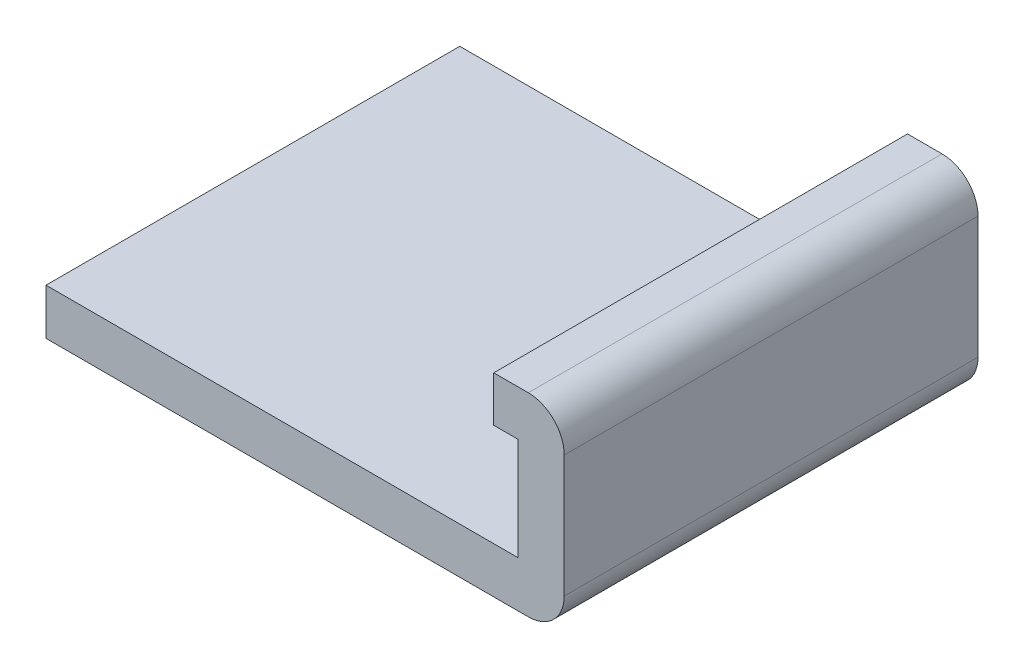
ISO-10303-21;
HEADER;
FILE_DESCRIPTION(('STEP AP214'),'2;1');
FILE_NAME('part.step','',(''),(''),'','','');
FILE_SCHEMA(('AUTOMOTIVE_DESIGN { 1 0 10303 214 1 1 1 1 }'));
ENDSEC;
DATA;
#1=APPLICATION_CONTEXT('core data for automotive mechanical design processes');
#2=APPLICATION_PROTOCOL_DEFINITION('international standard','automotive_design',2000,#1);
#3=PRODUCT_CONTEXT('',#1,'mechanical');
#4=PRODUCT('Part','Part','',(#3));
#5=PRODUCT_RELATED_PRODUCT_CATEGORY('part','',(#4));
#6=PRODUCT_DEFINITION_FORMATION('','',#4);
#7=PRODUCT_DEFINITION_CONTEXT('part definition',#1,'design');
#8=PRODUCT_DEFINITION('design','',#6,#7);
#9=PRODUCT_DEFINITION_SHAPE('','',#8);
#10=(LENGTH_UNIT() NAMED_UNIT(*) SI_UNIT(.MILLI.,.METRE.));
#11=(NAMED_UNIT(*) PLANE_ANGLE_UNIT() SI_UNIT($,.RADIAN.));
#12=(NAMED_UNIT(*) SI_UNIT($,.STERADIAN.) SOLID_ANGLE_UNIT());
#13=UNCERTAINTY_MEASURE_WITH_UNIT(LENGTH_MEASURE(1.E-05),#10,'distance_accuracy_value','');
#14=(GEOMETRIC_REPRESENTATION_CONTEXT(3) GLOBAL_UNCERTAINTY_ASSIGNED_CONTEXT((#13)) GLOBAL_UNIT_ASSIGNED_CONTEXT((#10,
#11,#12)) REPRESENTATION_CONTEXT('',''));
#15=CARTESIAN_POINT('',(0.,0.,0.));
#16=DIRECTION('',(0.,0.,1.));
#17=DIRECTION('',(1.,0.,0.));
#18=AXIS2_PLACEMENT_3D('',#15,#16,#17);
#19=CARTESIAN_POINT('',(5.024386882782,-0.857599020004001,-1.149999976158));
#20=DIRECTION('',(-1.,0.,0.));
#21=DIRECTION('',(0.,0.,1.));
#22=AXIS2_PLACEMENT_3D('',#19,#20,#21);
#23=PLANE('',#22);
#24=DIRECTION('',(0.,1.,0.));
#25=VECTOR('',#24,1.);
#26=CARTESIAN_POINT('',(5.024386882782,-0.857599020004001,1.150000023842));
#27=LINE('',#26,#25);
#28=CARTESIAN_POINT('',(5.024386882782,-1.110121011734,1.150000023842));
#29=VERTEX_POINT('',#28);
#30=CARTESIAN_POINT('',(5.024386882782,-0.857599020004001,1.14999992847457));
#31=VERTEX_POINT('',#30);
#32=EDGE_CURVE('E182',#29,#31,#27,.T.);
#33=ORIENTED_EDGE('',*,*,#32,.T.);
#34=DIRECTION('',(0.,0.,1.));
#35=VECTOR('',#34,1.);
#36=CARTESIAN_POINT('',(5.024386882782,-0.857599020004001,-1.149999976158));
#37=LINE('',#36,#35);
#38=CARTESIAN_POINT('',(5.024386882782,-0.857599020004001,-1.149999976158));
#39=VERTEX_POINT('',#38);
#40=EDGE_CURVE('E178',#39,#31,#37,.T.);
#41=ORIENTED_EDGE('',*,*,#40,.F.);
#42=DIRECTION('',(0.,1.,0.));
#43=VECTOR('',#42,1.);
#44=CARTESIAN_POINT('',(5.024386882782,-0.857599020004001,-1.149999976158));
#45=LINE('',#44,#43);
#46=CARTESIAN_POINT('',(5.024386882782,-1.110121011734,-1.149999976158));
#47=VERTEX_POINT('',#46);
#48=EDGE_CURVE('E190',#39,#47,#45,.F.);
#49=ORIENTED_EDGE('',*,*,#48,.T.);
#50=DIRECTION('',(0.,0.,-1.));
#51=VECTOR('',#50,1.);
#52=CARTESIAN_POINT('',(5.024386882782,-1.110121011734,-1.149999976158));
#53=LINE('',#52,#51);
#54=EDGE_CURVE('E102',#29,#47,#53,.T.);
#55=ORIENTED_EDGE('',*,*,#54,.F.);
#56=EDGE_LOOP('',(#33,#41,#49,#55));
#57=FACE_BOUND('',#56,.T.);
#58=ADVANCED_FACE('F17',(#57),#23,.T.);
#59=CARTESIAN_POINT('',(5.216207790375,-0.857599020004001,-1.149999976158));
#60=DIRECTION('',(0.,1.,0.));
#61=DIRECTION('',(0.,0.,1.));
#62=AXIS2_PLACEMENT_3D('',#59,#60,#61);
#63=PLANE('',#62);
#64=DIRECTION('',(1.,0.,0.));
#65=VECTOR('',#64,1.);
#66=CARTESIAN_POINT('',(5.216207790375,-0.857599020004001,1.150000023842));
#67=LINE('',#66,#65);
#68=CARTESIAN_POINT('',(5.216207790375,-0.857599020004,1.150000023842));
#69=VERTEX_POINT('',#68);
#70=EDGE_CURVE('E173',#31,#69,#67,.T.);
#71=ORIENTED_EDGE('',*,*,#70,.T.);
#72=DIRECTION('',(0.,0.,1.));
#73=VECTOR('',#72,1.);
#74=CARTESIAN_POINT('',(5.216207790375,-0.857599020003999,-1.149999976158));
#75=LINE('',#74,#73);
#76=CARTESIAN_POINT('',(5.216207790375,-0.857599020004,-1.149999976158));
#77=VERTEX_POINT('',#76);
#78=EDGE_CURVE('E101',#77,#69,#75,.T.);
#79=ORIENTED_EDGE('',*,*,#78,.F.);
#80=DIRECTION('',(1.,0.,0.));
#81=VECTOR('',#80,1.);
#82=CARTESIAN_POINT('',(5.216207790375,-0.857599020004001,-1.149999976158));
#83=LINE('',#82,#81);
#84=EDGE_CURVE('E97',#77,#39,#83,.F.);
#85=ORIENTED_EDGE('',*,*,#84,.T.);
#86=ORIENTED_EDGE('',*,*,#40,.T.);
#87=EDGE_LOOP('',(#71,#79,#85,#86));
#88=FACE_BOUND('',#87,.T.);
#89=ADVANCED_FACE('F228',(#88),#63,.T.);
#90=CARTESIAN_POINT('',(5.024386882782,-1.110121011734,-1.149999976158));
#91=DIRECTION('',(0.,-1.,0.));
#92=DIRECTION('',(0.,0.,-1.));
#93=AXIS2_PLACEMENT_3D('',#90,#91,#92);
#94=PLANE('',#93);
#95=DIRECTION('',(1.,0.,0.));
#96=VECTOR('',#95,1.);
#97=CARTESIAN_POINT('',(5.024386882782,-1.110121011734,1.150000023842));
#98=LINE('',#97,#96);
#99=CARTESIAN_POINT('',(5.159293174744,-1.110121011734,1.150000023842));
#100=VERTEX_POINT('',#99);
#101=EDGE_CURVE('E165',#100,#29,#98,.F.);
#102=ORIENTED_EDGE('',*,*,#101,.T.);
#103=ORIENTED_EDGE('',*,*,#54,.T.);
#104=DIRECTION('',(1.,0.,0.));
#105=VECTOR('',#104,1.);
#106=CARTESIAN_POINT('',(5.024386882782,-1.110121011734,-1.149999976158));
#107=LINE('',#106,#105);
#108=CARTESIAN_POINT('',(5.159293174744,-1.110121011734,-1.149999976158));
#109=VERTEX_POINT('',#108);
#110=EDGE_CURVE('E168',#47,#109,#107,.T.);
#111=ORIENTED_EDGE('',*,*,#110,.T.);
#112=DIRECTION('',(0.,0.,1.));
#113=VECTOR('',#112,1.);
#114=CARTESIAN_POINT('',(5.159293174744,-1.110121011734,-1.149999976158));
#115=LINE('',#114,#113);
#116=EDGE_CURVE('E111',#100,#109,#115,.F.);
#117=ORIENTED_EDGE('',*,*,#116,.F.);
#118=EDGE_LOOP('',(#102,#103,#111,#117));
#119=FACE_BOUND('',#118,.T.);
#120=ADVANCED_FACE('F235',(#119),#94,.T.);
#121=CARTESIAN_POINT('',(5.216207790375,-1.057599020004,-1.149999976158));
#122=DIRECTION('',(0.,0.,1.));
#123=DIRECTION('',(1.,0.,0.));
#124=AXIS2_PLACEMENT_3D('',#121,#122,#123);
#125=CYLINDRICAL_SURFACE('',#124,0.200000000000001);
#126=CARTESIAN_POINT('',(5.216207790375,-1.057599020004,1.150000023842));
#127=DIRECTION('',(0.,0.,1.));
#128=DIRECTION('',(1.,0.,0.));
#129=AXIS2_PLACEMENT_3D('',#126,#127,#128);
#130=CIRCLE('',#129,0.200000000000001);
#131=CARTESIAN_POINT('',(5.416207790375,-1.057599020004,1.150000023842));
#132=VERTEX_POINT('',#131);
#133=EDGE_CURVE('E107',#69,#132,#130,.F.);
#134=ORIENTED_EDGE('',*,*,#133,.T.);
#135=DIRECTION('',(0.,0.,-1.));
#136=VECTOR('',#135,1.);
#137=CARTESIAN_POINT('',(5.416207790375,-1.057599020004,-1.149999976158));
#138=LINE('',#137,#136);
#139=CARTESIAN_POINT('',(5.416207790375,-1.057599020004,-1.1500002622603));
#140=VERTEX_POINT('',#139);
#141=EDGE_CURVE('E104',#140,#132,#138,.F.);
#142=ORIENTED_EDGE('',*,*,#141,.F.);
#143=CARTESIAN_POINT('',(5.216207790375,-1.057599020004,-1.149999976158));
#144=DIRECTION('',(0.,0.,1.));
#145=DIRECTION('',(1.,0.,0.));
#146=AXIS2_PLACEMENT_3D('',#143,#144,#145);
#147=CIRCLE('',#146,0.200000000000001);
#148=EDGE_CURVE('E20',#140,#77,#147,.T.);
#149=ORIENTED_EDGE('',*,*,#148,.T.);
#150=ORIENTED_EDGE('',*,*,#78,.T.);
#151=EDGE_LOOP('',(#134,#142,#149,#150));
#152=FACE_BOUND('',#151,.T.);
#153=ADVANCED_FACE('F105',(#152),#125,.T.);
#154=CARTESIAN_POINT('',(5.159293174744,-1.110121011734,-1.149999976158));
#155=DIRECTION('',(-1.,0.,0.));
#156=DIRECTION('',(0.,0.,1.));
#157=AXIS2_PLACEMENT_3D('',#154,#155,#156);
#158=PLANE('',#157);
#159=DIRECTION('',(0.,1.,0.));
#160=VECTOR('',#159,1.);
#161=CARTESIAN_POINT('',(5.159293174744,-1.110121011734,1.150000023842));
#162=LINE('',#161,#160);
#163=CARTESIAN_POINT('',(5.159293174744,-1.680145025253,1.14999964237227));
#164=VERTEX_POINT('',#163);
#165=EDGE_CURVE('E152',#164,#100,#162,.T.);
#166=ORIENTED_EDGE('',*,*,#165,.T.);
#167=ORIENTED_EDGE('',*,*,#116,.T.);
#168=DIRECTION('',(0.,1.,0.));
#169=VECTOR('',#168,1.);
#170=CARTESIAN_POINT('',(5.159293174744,-1.110121011734,-1.149999976158));
#171=LINE('',#170,#169);
#172=CARTESIAN_POINT('',(5.159293174744,-1.680145025253,-1.15000016689286));
#173=VERTEX_POINT('',#172);
#174=EDGE_CURVE('E155',#109,#173,#171,.F.);
#175=ORIENTED_EDGE('',*,*,#174,.T.);
#176=DIRECTION('',(0.,0.,1.));
#177=VECTOR('',#176,1.);
#178=CARTESIAN_POINT('',(5.159293174744,-1.680145025253,-1.149999976158));
#179=LINE('',#178,#177);
#180=EDGE_CURVE('E118',#164,#173,#179,.F.);
#181=ORIENTED_EDGE('',*,*,#180,.F.);
#182=EDGE_LOOP('',(#166,#167,#175,#181));
#183=FACE_BOUND('',#182,.T.);
#184=ADVANCED_FACE('F237',(#183),#158,.T.);
#185=CARTESIAN_POINT('',(5.416207790375,-1.736329960823,-1.149999976158));
#186=DIRECTION('',(1.,0.,0.));
#187=DIRECTION('',(0.,0.,-1.));
#188=AXIS2_PLACEMENT_3D('',#185,#186,#187);
#189=PLANE('',#188);
#190=DIRECTION('',(0.,1.,0.));
#191=VECTOR('',#190,1.);
#192=CARTESIAN_POINT('',(5.416207790375,-1.736329960823,1.150000023842));
#193=LINE('',#192,#191);
#194=CARTESIAN_POINT('',(5.416207790375,-1.736329960823,1.150000023842));
#195=VERTEX_POINT('',#194);
#196=EDGE_CURVE('E110',#132,#195,#193,.F.);
#197=ORIENTED_EDGE('',*,*,#196,.T.);
#198=DIRECTION('',(0.,0.,1.));
#199=VECTOR('',#198,1.);
#200=CARTESIAN_POINT('',(5.416207790375,-1.736329960823,-1.149999976158));
#201=LINE('',#200,#199);
#202=CARTESIAN_POINT('',(5.416207790375,-1.736329960823,-1.1500002622603));
#203=VERTEX_POINT('',#202);
#204=EDGE_CURVE('E115',#203,#195,#201,.T.);
#205=ORIENTED_EDGE('',*,*,#204,.F.);
#206=DIRECTION('',(0.,1.,0.));
#207=VECTOR('',#206,1.);
#208=CARTESIAN_POINT('',(5.416207790375,-1.3969644904135,-1.15000054836259));
#209=LINE('',#208,#207);
#210=EDGE_CURVE('E94',#140,#203,#209,.F.);
#211=ORIENTED_EDGE('',*,*,#210,.F.);
#212=ORIENTED_EDGE('',*,*,#141,.T.);
#213=EDGE_LOOP('',(#197,#205,#211,#212));
#214=FACE_BOUND('',#213,.T.);
#215=ADVANCED_FACE('F113',(#214),#189,.T.);
#216=CARTESIAN_POINT('',(5.159293174744,-1.680145025253,-1.149999976158));
#217=DIRECTION('',(0.,1.,0.));
#218=DIRECTION('',(0.,0.,1.));
#219=AXIS2_PLACEMENT_3D('',#216,#217,#218);
#220=PLANE('',#219);
#221=DIRECTION('',(-1.,0.,0.));
#222=VECTOR('',#221,1.);
#223=CARTESIAN_POINT('',(3.975875377655,-1.680145025253,1.14999945163741));
#224=LINE('',#223,#222);
#225=CARTESIAN_POINT('',(2.535542964935,-1.680145025253,1.14999983310714));
#226=VERTEX_POINT('',#225);
#227=EDGE_CURVE('E132',#226,#164,#224,.F.);
#228=ORIENTED_EDGE('',*,*,#227,.T.);
#229=ORIENTED_EDGE('',*,*,#180,.T.);
#230=DIRECTION('',(-1.,0.,0.));
#231=VECTOR('',#230,1.);
#232=CARTESIAN_POINT('',(3.975875377655,-1.680145025253,-1.15000054836259));
#233=LINE('',#232,#231);
#234=CARTESIAN_POINT('',(2.535542964935,-1.680145025253,-1.15000016689286));
#235=VERTEX_POINT('',#234);
#236=EDGE_CURVE('E117',#235,#173,#233,.F.);
#237=ORIENTED_EDGE('',*,*,#236,.F.);
#238=DIRECTION('',(0.,0.,1.));
#239=VECTOR('',#238,1.);
#240=CARTESIAN_POINT('',(2.535542964935,-1.680145025253,-1.149999976158));
#241=LINE('',#240,#239);
#242=EDGE_CURVE('E140',#226,#235,#241,.F.);
#243=ORIENTED_EDGE('',*,*,#242,.F.);
#244=EDGE_LOOP('',(#228,#229,#237,#243));
#245=FACE_BOUND('',#244,.T.);
#246=ADVANCED_FACE('F239',(#245),#220,.T.);
#247=CARTESIAN_POINT('',(3.975875377655,-1.3969644904135,-1.15000054836259));
#248=DIRECTION('',(0.,0.,-1.));
#249=DIRECTION('',(-1.,0.,0.));
#250=AXIS2_PLACEMENT_3D('',#247,#248,#249);
#251=PLANE('',#250);
#252=ORIENTED_EDGE('',*,*,#48,.F.);
#253=ORIENTED_EDGE('',*,*,#84,.F.);
#254=ORIENTED_EDGE('',*,*,#148,.F.);
#255=ORIENTED_EDGE('',*,*,#210,.T.);
#256=CARTESIAN_POINT('',(5.216207790375,-1.736329960823,-1.149999976158));
#257=DIRECTION('',(0.,0.,1.));
#258=DIRECTION('',(1.,0.,0.));
#259=AXIS2_PLACEMENT_3D('',#256,#257,#258);
#260=CIRCLE('',#259,0.200000000000001);
#261=CARTESIAN_POINT('',(5.216207790375,-1.936329960823,-1.149999976158));
#262=VERTEX_POINT('',#261);
#263=EDGE_CURVE('E121',#262,#203,#260,.T.);
#264=ORIENTED_EDGE('',*,*,#263,.F.);
#265=DIRECTION('',(1.,0.,0.));
#266=VECTOR('',#265,1.);
#267=CARTESIAN_POINT('',(2.535542964935,-1.936329960823,-1.149999976158));
#268=LINE('',#267,#266);
#269=CARTESIAN_POINT('',(2.535542964935,-1.936329960823,-1.149999976158));
#270=VERTEX_POINT('',#269);
#271=EDGE_CURVE('E143',#270,#262,#268,.T.);
#272=ORIENTED_EDGE('',*,*,#271,.F.);
#273=DIRECTION('',(0.,1.,0.));
#274=VECTOR('',#273,1.);
#275=CARTESIAN_POINT('',(2.535542964935,-1.680145025253,-1.149999976158));
#276=LINE('',#275,#274);
#277=EDGE_CURVE('E129',#235,#270,#276,.F.);
#278=ORIENTED_EDGE('',*,*,#277,.F.);
#279=ORIENTED_EDGE('',*,*,#236,.T.);
#280=ORIENTED_EDGE('',*,*,#174,.F.);
#281=ORIENTED_EDGE('',*,*,#110,.F.);
#282=EDGE_LOOP('',(#252,#253,#254,#255,#264,#272,#278,#279,#280,#281));
#283=FACE_BOUND('',#282,.T.);
#284=ADVANCED_FACE('F92',(#283),#251,.T.);
#285=CARTESIAN_POINT('',(5.216207790375,-1.736329960823,-1.149999976158));
#286=DIRECTION('',(0.,0.,1.));
#287=DIRECTION('',(1.,0.,0.));
#288=AXIS2_PLACEMENT_3D('',#285,#286,#287);
#289=CYLINDRICAL_SURFACE('',#288,0.200000000000001);
#290=CARTESIAN_POINT('',(5.216207790375,-1.736329960823,1.150000023842));
#291=DIRECTION('',(0.,0.,1.));
#292=DIRECTION('',(1.,0.,0.));
#293=AXIS2_PLACEMENT_3D('',#290,#291,#292);
#294=CIRCLE('',#293,0.200000000000001);
#295=CARTESIAN_POINT('',(5.216207790375,-1.936329960823,1.150000023842));
#296=VERTEX_POINT('',#295);
#297=EDGE_CURVE('E137',#195,#296,#294,.F.);
#298=ORIENTED_EDGE('',*,*,#297,.T.);
#299=DIRECTION('',(0.,0.,-1.));
#300=VECTOR('',#299,1.);
#301=CARTESIAN_POINT('',(5.216207790375,-1.936329960823,-1.149999976158));
#302=LINE('',#301,#300);
#303=EDGE_CURVE('E207',#262,#296,#302,.F.);
#304=ORIENTED_EDGE('',*,*,#303,.F.);
#305=ORIENTED_EDGE('',*,*,#263,.T.);
#306=ORIENTED_EDGE('',*,*,#204,.T.);
#307=EDGE_LOOP('',(#298,#304,#305,#306));
#308=FACE_BOUND('',#307,.T.);
#309=ADVANCED_FACE('F204',(#308),#289,.T.);
#310=CARTESIAN_POINT('',(3.975875377655,-1.3969644904135,1.14999945163741));
#311=DIRECTION('',(0.,0.,-1.));
#312=DIRECTION('',(-1.,0.,0.));
#313=AXIS2_PLACEMENT_3D('',#310,#311,#312);
#314=PLANE('',#313);
#315=ORIENTED_EDGE('',*,*,#70,.F.);
#316=ORIENTED_EDGE('',*,*,#32,.F.);
#317=ORIENTED_EDGE('',*,*,#101,.F.);
#318=ORIENTED_EDGE('',*,*,#165,.F.);
#319=ORIENTED_EDGE('',*,*,#227,.F.);
#320=DIRECTION('',(0.,1.,0.));
#321=VECTOR('',#320,1.);
#322=CARTESIAN_POINT('',(2.535542964935,-1.680145025253,1.150000023842));
#323=LINE('',#322,#321);
#324=CARTESIAN_POINT('',(2.535542964935,-1.936329960823,1.150000023842));
#325=VERTEX_POINT('',#324);
#326=EDGE_CURVE('E35',#325,#226,#323,.T.);
#327=ORIENTED_EDGE('',*,*,#326,.F.);
#328=DIRECTION('',(1.,0.,0.));
#329=VECTOR('',#328,1.);
#330=CARTESIAN_POINT('',(2.535542964935,-1.936329960823,1.150000023842));
#331=LINE('',#330,#329);
#332=EDGE_CURVE('E26',#296,#325,#331,.F.);
#333=ORIENTED_EDGE('',*,*,#332,.F.);
#334=ORIENTED_EDGE('',*,*,#297,.F.);
#335=ORIENTED_EDGE('',*,*,#196,.F.);
#336=ORIENTED_EDGE('',*,*,#133,.F.);
#337=EDGE_LOOP('',(#315,#316,#317,#318,#319,#327,#333,#334,#335,#336));
#338=FACE_BOUND('',#337,.T.);
#339=ADVANCED_FACE('F226',(#338),#314,.F.);
#340=CARTESIAN_POINT('',(2.535542964935,-1.680145025253,-1.149999976158));
#341=DIRECTION('',(-1.,0.,0.));
#342=DIRECTION('',(0.,0.,1.));
#343=AXIS2_PLACEMENT_3D('',#340,#341,#342);
#344=PLANE('',#343);
#345=ORIENTED_EDGE('',*,*,#326,.T.);
#346=ORIENTED_EDGE('',*,*,#242,.T.);
#347=ORIENTED_EDGE('',*,*,#277,.T.);
#348=DIRECTION('',(0.,0.,-1.));
#349=VECTOR('',#348,1.);
#350=CARTESIAN_POINT('',(2.535542964935,-1.936329960823,-1.149999976158));
#351=LINE('',#350,#349);
#352=EDGE_CURVE('E11',#325,#270,#351,.T.);
#353=ORIENTED_EDGE('',*,*,#352,.F.);
#354=EDGE_LOOP('',(#345,#346,#347,#353));
#355=FACE_BOUND('',#354,.T.);
#356=ADVANCED_FACE('F212',(#355),#344,.T.);
#357=CARTESIAN_POINT('',(2.535542964935,-1.936329960823,-1.149999976158));
#358=DIRECTION('',(0.,-1.,0.));
#359=DIRECTION('',(0.,0.,-1.));
#360=AXIS2_PLACEMENT_3D('',#357,#358,#359);
#361=PLANE('',#360);
#362=ORIENTED_EDGE('',*,*,#332,.T.);
#363=ORIENTED_EDGE('',*,*,#352,.T.);
#364=ORIENTED_EDGE('',*,*,#271,.T.);
#365=ORIENTED_EDGE('',*,*,#303,.T.);
#366=EDGE_LOOP('',(#362,#363,#364,#365));
#367=FACE_BOUND('',#366,.T.);
#368=ADVANCED_FACE('F215',(#367),#361,.T.);
#369=CLOSED_SHELL('',(#58,#89,#120,#153,#184,#215,#246,#284,#309,#339,#356,#368));
#370=MANIFOLD_SOLID_BREP('B1',#369);
#371=ADVANCED_BREP_SHAPE_REPRESENTATION('',(#18,#370),#14);
#372=SHAPE_DEFINITION_REPRESENTATION(#9,#371);
ENDSEC;
END-ISO-10303-21;
